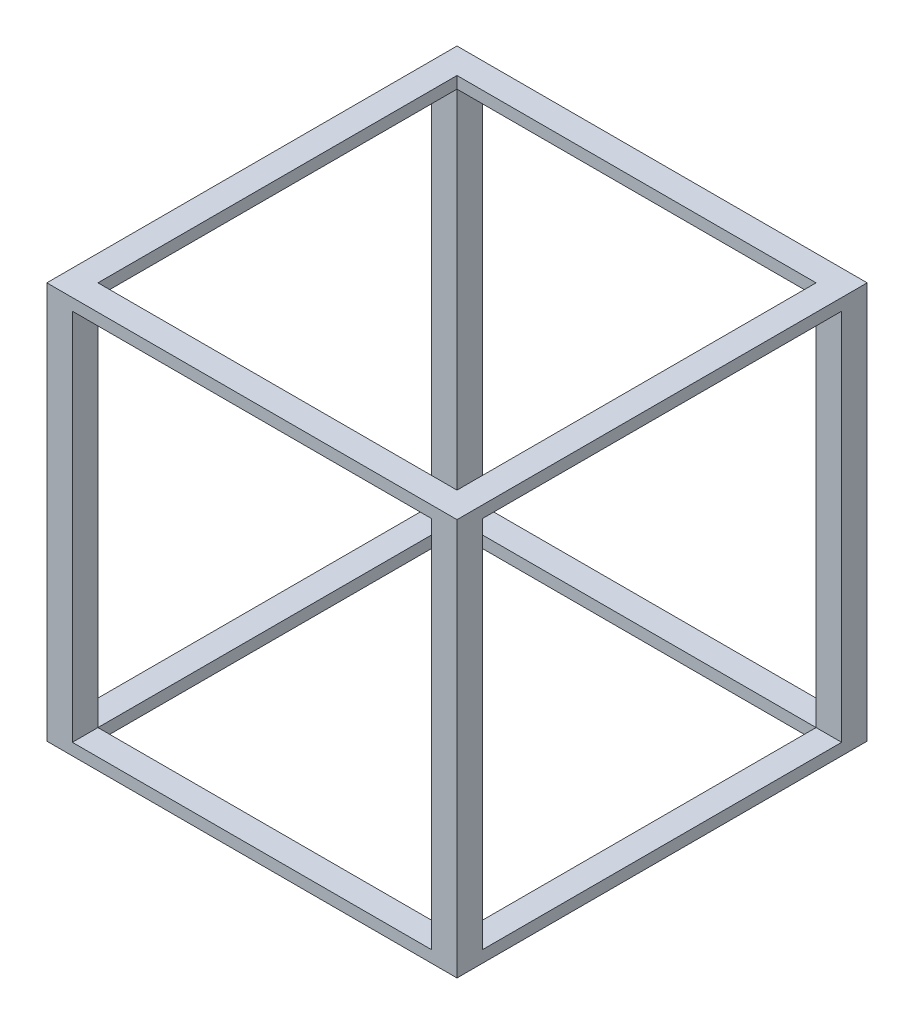
ISO-10303-21;
HEADER;
FILE_DESCRIPTION(('STEP AP214'),'2;1');
FILE_NAME('part.step','',(''),(''),'','','');
FILE_SCHEMA(('AUTOMOTIVE_DESIGN { 1 0 10303 214 1 1 1 1 }'));
ENDSEC;
DATA;
#1=APPLICATION_CONTEXT('core data for automotive mechanical design processes');
#2=APPLICATION_PROTOCOL_DEFINITION('international standard','automotive_design',2000,#1);
#3=PRODUCT_CONTEXT('',#1,'mechanical');
#4=PRODUCT('Part','Part','',(#3));
#5=PRODUCT_RELATED_PRODUCT_CATEGORY('part','',(#4));
#6=PRODUCT_DEFINITION_FORMATION('','',#4);
#7=PRODUCT_DEFINITION_CONTEXT('part definition',#1,'design');
#8=PRODUCT_DEFINITION('design','',#6,#7);
#9=PRODUCT_DEFINITION_SHAPE('','',#8);
#10=(LENGTH_UNIT() NAMED_UNIT(*) SI_UNIT(.MILLI.,.METRE.));
#11=(NAMED_UNIT(*) PLANE_ANGLE_UNIT() SI_UNIT($,.RADIAN.));
#12=(NAMED_UNIT(*) SI_UNIT($,.STERADIAN.) SOLID_ANGLE_UNIT());
#13=UNCERTAINTY_MEASURE_WITH_UNIT(LENGTH_MEASURE(1.E-05),#10,'distance_accuracy_value','');
#14=(GEOMETRIC_REPRESENTATION_CONTEXT(3) GLOBAL_UNCERTAINTY_ASSIGNED_CONTEXT((#13)) GLOBAL_UNIT_ASSIGNED_CONTEXT((#10,
#11,#12)) REPRESENTATION_CONTEXT('',''));
#15=CARTESIAN_POINT('',(0.,0.,0.));
#16=DIRECTION('',(0.,0.,1.));
#17=DIRECTION('',(1.,0.,0.));
#18=AXIS2_PLACEMENT_3D('',#15,#16,#17);
#19=CARTESIAN_POINT('',(0.,3.,0.));
#20=DIRECTION('',(0.,-1.,0.));
#21=DIRECTION('',(0.,0.,-1.));
#22=AXIS2_PLACEMENT_3D('',#19,#20,#21);
#23=PLANE('',#22);
#24=DIRECTION('',(0.,0.,1.));
#25=VECTOR('',#24,1.);
#26=CARTESIAN_POINT('',(45.6804986141416,3.,45.6804986141416));
#27=LINE('',#26,#25);
#28=CARTESIAN_POINT('',(45.6804986141416,3.,45.6804986141416));
#29=VERTEX_POINT('',#28);
#30=CARTESIAN_POINT('',(45.6804986141416,3.,52.1804986141418));
#31=VERTEX_POINT('',#30);
#32=EDGE_CURVE('E286',#29,#31,#27,.T.);
#33=ORIENTED_EDGE('',*,*,#32,.F.);
#34=DIRECTION('',(1.,0.,0.));
#35=VECTOR('',#34,1.);
#36=CARTESIAN_POINT('',(45.6804986141416,3.,45.6804986141416));
#37=LINE('',#36,#35);
#38=CARTESIAN_POINT('',(-45.6804986141418,3.,45.6804986141416));
#39=VERTEX_POINT('',#38);
#40=EDGE_CURVE('E386',#39,#29,#37,.T.);
#41=ORIENTED_EDGE('',*,*,#40,.F.);
#42=DIRECTION('',(0.,0.,-1.));
#43=VECTOR('',#42,1.);
#44=CARTESIAN_POINT('',(-45.6804986141418,3.,45.6804986141416));
#45=LINE('',#44,#43);
#46=CARTESIAN_POINT('',(-45.6804986141418,3.,52.1804986141418));
#47=VERTEX_POINT('',#46);
#48=EDGE_CURVE('E314',#47,#39,#45,.T.);
#49=ORIENTED_EDGE('',*,*,#48,.F.);
#50=DIRECTION('',(1.,0.,0.));
#51=VECTOR('',#50,1.);
#52=CARTESIAN_POINT('',(-52.1804986141418,3.,52.1804986141418));
#53=LINE('',#52,#51);
#54=EDGE_CURVE('E67',#47,#31,#53,.T.);
#55=ORIENTED_EDGE('',*,*,#54,.T.);
#56=EDGE_LOOP('',(#33,#41,#49,#55));
#57=FACE_BOUND('',#56,.T.);
#58=ADVANCED_FACE('F43',(#57),#23,.F.);
#59=DIRECTION('',(-1.,0.,0.));
#60=VECTOR('',#59,1.);
#61=CARTESIAN_POINT('',(45.6804986141416,3.,45.6804986141416));
#62=LINE('',#61,#60);
#63=CARTESIAN_POINT('',(52.1804986141418,3.,45.6804986141416));
#64=VERTEX_POINT('',#63);
#65=EDGE_CURVE('E59',#64,#29,#62,.T.);
#66=ORIENTED_EDGE('',*,*,#65,.F.);
#67=DIRECTION('',(0.,0.,-1.));
#68=VECTOR('',#67,1.);
#69=CARTESIAN_POINT('',(52.1804986141418,3.,52.1804986141418));
#70=LINE('',#69,#68);
#71=CARTESIAN_POINT('',(52.1804986141418,3.,-45.6804986141417));
#72=VERTEX_POINT('',#71);
#73=EDGE_CURVE('E428',#64,#72,#70,.T.);
#74=ORIENTED_EDGE('',*,*,#73,.T.);
#75=DIRECTION('',(1.,0.,0.));
#76=VECTOR('',#75,1.);
#77=CARTESIAN_POINT('',(52.1804986141418,3.,-45.6804986141418));
#78=LINE('',#77,#76);
#79=CARTESIAN_POINT('',(45.6804986141416,3.,-45.6804986141418));
#80=VERTEX_POINT('',#79);
#81=EDGE_CURVE('E338',#80,#72,#78,.T.);
#82=ORIENTED_EDGE('',*,*,#81,.F.);
#83=DIRECTION('',(0.,0.,-1.));
#84=VECTOR('',#83,1.);
#85=CARTESIAN_POINT('',(45.6804986141416,3.,45.6804986141416));
#86=LINE('',#85,#84);
#87=EDGE_CURVE('E391',#29,#80,#86,.T.);
#88=ORIENTED_EDGE('',*,*,#87,.F.);
#89=EDGE_LOOP('',(#66,#74,#82,#88));
#90=FACE_BOUND('',#89,.T.);
#91=ADVANCED_FACE('F554',(#90),#23,.F.);
#92=DIRECTION('',(-1.,0.,0.));
#93=VECTOR('',#92,1.);
#94=CARTESIAN_POINT('',(-45.6804986141418,3.,45.6804986141416));
#95=LINE('',#94,#93);
#96=CARTESIAN_POINT('',(-52.1804986141418,3.,45.6804986141416));
#97=VERTEX_POINT('',#96);
#98=EDGE_CURVE('E310',#39,#97,#95,.T.);
#99=ORIENTED_EDGE('',*,*,#98,.F.);
#100=DIRECTION('',(0.,0.,1.));
#101=VECTOR('',#100,1.);
#102=CARTESIAN_POINT('',(-45.6804986141418,3.,45.6804986141416));
#103=LINE('',#102,#101);
#104=CARTESIAN_POINT('',(-45.6804986141418,3.,-45.6804986141418));
#105=VERTEX_POINT('',#104);
#106=EDGE_CURVE('E382',#105,#39,#103,.T.);
#107=ORIENTED_EDGE('',*,*,#106,.F.);
#108=DIRECTION('',(1.,0.,0.));
#109=VECTOR('',#108,1.);
#110=CARTESIAN_POINT('',(-52.1804986141418,3.,-45.6804986141418));
#111=LINE('',#110,#109);
#112=CARTESIAN_POINT('',(-52.1804986141418,3.,-45.6804986141417));
#113=VERTEX_POINT('',#112);
#114=EDGE_CURVE('E347',#113,#105,#111,.T.);
#115=ORIENTED_EDGE('',*,*,#114,.F.);
#116=DIRECTION('',(0.,0.,1.));
#117=VECTOR('',#116,1.);
#118=CARTESIAN_POINT('',(-52.1804986141418,3.,52.1804986141418));
#119=LINE('',#118,#117);
#120=EDGE_CURVE('E435',#113,#97,#119,.T.);
#121=ORIENTED_EDGE('',*,*,#120,.T.);
#122=EDGE_LOOP('',(#99,#107,#115,#121));
#123=FACE_BOUND('',#122,.T.);
#124=ADVANCED_FACE('F519',(#123),#23,.F.);
#125=DIRECTION('',(0.,0.,1.));
#126=VECTOR('',#125,1.);
#127=CARTESIAN_POINT('',(45.6804986141416,3.,-52.1804986141418));
#128=LINE('',#127,#126);
#129=CARTESIAN_POINT('',(45.6804986141416,3.,-52.1804986141418));
#130=VERTEX_POINT('',#129);
#131=EDGE_CURVE('E342',#130,#80,#128,.T.);
#132=ORIENTED_EDGE('',*,*,#131,.F.);
#133=DIRECTION('',(-1.,0.,0.));
#134=VECTOR('',#133,1.);
#135=CARTESIAN_POINT('',(-52.1804986141418,3.,-52.1804986141418));
#136=LINE('',#135,#134);
#137=CARTESIAN_POINT('',(-45.6804986141418,3.,-52.1804986141418));
#138=VERTEX_POINT('',#137);
#139=EDGE_CURVE('E431',#130,#138,#136,.T.);
#140=ORIENTED_EDGE('',*,*,#139,.T.);
#141=DIRECTION('',(0.,0.,-1.));
#142=VECTOR('',#141,1.);
#143=CARTESIAN_POINT('',(-45.6804986141418,3.,-52.1804986141418));
#144=LINE('',#143,#142);
#145=EDGE_CURVE('E359',#105,#138,#144,.T.);
#146=ORIENTED_EDGE('',*,*,#145,.F.);
#147=DIRECTION('',(-1.,0.,0.));
#148=VECTOR('',#147,1.);
#149=CARTESIAN_POINT('',(45.6804986141416,3.,-45.6804986141418));
#150=LINE('',#149,#148);
#151=EDGE_CURVE('E395',#80,#105,#150,.T.);
#152=ORIENTED_EDGE('',*,*,#151,.F.);
#153=EDGE_LOOP('',(#132,#140,#146,#152));
#154=FACE_BOUND('',#153,.T.);
#155=ADVANCED_FACE('F531',(#154),#23,.F.);
#156=CARTESIAN_POINT('',(0.,0.,0.));
#157=DIRECTION('',(0.,-1.,0.));
#158=DIRECTION('',(0.,0.,-1.));
#159=AXIS2_PLACEMENT_3D('',#156,#157,#158);
#160=PLANE('',#159);
#161=DIRECTION('',(0.,0.,-1.));
#162=VECTOR('',#161,1.);
#163=CARTESIAN_POINT('',(52.1804986141418,0.,52.1804986141418));
#164=LINE('',#163,#162);
#165=CARTESIAN_POINT('',(52.1804986141418,0.,52.1804986141418));
#166=VERTEX_POINT('',#165);
#167=CARTESIAN_POINT('',(52.1804986141418,0.,-52.1804986141418));
#168=VERTEX_POINT('',#167);
#169=EDGE_CURVE('E427',#166,#168,#164,.T.);
#170=ORIENTED_EDGE('',*,*,#169,.F.);
#171=DIRECTION('',(1.,0.,0.));
#172=VECTOR('',#171,1.);
#173=CARTESIAN_POINT('',(-52.1804986141418,0.,52.1804986141418));
#174=LINE('',#173,#172);
#175=CARTESIAN_POINT('',(-52.1804986141418,0.,52.1804986141418));
#176=VERTEX_POINT('',#175);
#177=EDGE_CURVE('E432',#176,#166,#174,.T.);
#178=ORIENTED_EDGE('',*,*,#177,.F.);
#179=DIRECTION('',(0.,0.,1.));
#180=VECTOR('',#179,1.);
#181=CARTESIAN_POINT('',(-52.1804986141418,0.,52.1804986141418));
#182=LINE('',#181,#180);
#183=CARTESIAN_POINT('',(-52.1804986141418,0.,-52.1804986141418));
#184=VERTEX_POINT('',#183);
#185=EDGE_CURVE('E447',#184,#176,#182,.T.);
#186=ORIENTED_EDGE('',*,*,#185,.F.);
#187=DIRECTION('',(-1.,0.,0.));
#188=VECTOR('',#187,1.);
#189=CARTESIAN_POINT('',(-52.1804986141418,0.,-52.1804986141418));
#190=LINE('',#189,#188);
#191=EDGE_CURVE('E444',#168,#184,#190,.T.);
#192=ORIENTED_EDGE('',*,*,#191,.F.);
#193=EDGE_LOOP('',(#170,#178,#186,#192));
#194=FACE_BOUND('',#193,.T.);
#195=DIRECTION('',(-1.,0.,0.));
#196=VECTOR('',#195,1.);
#197=CARTESIAN_POINT('',(45.6804986141416,0.,-45.6804986141418));
#198=LINE('',#197,#196);
#199=CARTESIAN_POINT('',(45.6804986141416,0.,-45.6804986141418));
#200=VERTEX_POINT('',#199);
#201=CARTESIAN_POINT('',(-45.6804986141418,0.,-45.6804986141418));
#202=VERTEX_POINT('',#201);
#203=EDGE_CURVE('E387',#200,#202,#198,.T.);
#204=ORIENTED_EDGE('',*,*,#203,.T.);
#205=DIRECTION('',(0.,0.,1.));
#206=VECTOR('',#205,1.);
#207=CARTESIAN_POINT('',(-45.6804986141418,0.,45.6804986141416));
#208=LINE('',#207,#206);
#209=CARTESIAN_POINT('',(-45.6804986141418,0.,45.6804986141416));
#210=VERTEX_POINT('',#209);
#211=EDGE_CURVE('E381',#202,#210,#208,.T.);
#212=ORIENTED_EDGE('',*,*,#211,.T.);
#213=DIRECTION('',(1.,0.,0.));
#214=VECTOR('',#213,1.);
#215=CARTESIAN_POINT('',(45.6804986141416,0.,45.6804986141416));
#216=LINE('',#215,#214);
#217=CARTESIAN_POINT('',(45.6804986141416,0.,45.6804986141416));
#218=VERTEX_POINT('',#217);
#219=EDGE_CURVE('E403',#210,#218,#216,.T.);
#220=ORIENTED_EDGE('',*,*,#219,.T.);
#221=DIRECTION('',(0.,0.,-1.));
#222=VECTOR('',#221,1.);
#223=CARTESIAN_POINT('',(45.6804986141416,0.,45.6804986141416));
#224=LINE('',#223,#222);
#225=EDGE_CURVE('E407',#218,#200,#224,.T.);
#226=ORIENTED_EDGE('',*,*,#225,.T.);
#227=EDGE_LOOP('',(#204,#212,#220,#226));
#228=FACE_BOUND('',#227,.T.);
#229=ADVANCED_FACE('F469',(#194,#228),#160,.T.);
#230=CARTESIAN_POINT('',(52.1804986141418,3.,52.1804986141418));
#231=DIRECTION('',(-1.,0.,0.));
#232=DIRECTION('',(0.,0.,1.));
#233=AXIS2_PLACEMENT_3D('',#230,#231,#232);
#234=PLANE('',#233);
#235=DIRECTION('',(0.,-1.,0.));
#236=VECTOR('',#235,1.);
#237=CARTESIAN_POINT('',(52.1804986141418,3.,-52.1804986141418));
#238=LINE('',#237,#236);
#239=CARTESIAN_POINT('',(52.1804986141418,101.,-52.1804986141418));
#240=VERTEX_POINT('',#239);
#241=EDGE_CURVE('E11',#240,#168,#238,.T.);
#242=ORIENTED_EDGE('',*,*,#241,.F.);
#243=DIRECTION('',(0.,0.,-1.));
#244=VECTOR('',#243,1.);
#245=CARTESIAN_POINT('',(52.1804986141418,101.,-52.1804986141418));
#246=LINE('',#245,#244);
#247=CARTESIAN_POINT('',(52.1804986141418,101.,52.1804986141418));
#248=VERTEX_POINT('',#247);
#249=EDGE_CURVE('E250',#248,#240,#246,.T.);
#250=ORIENTED_EDGE('',*,*,#249,.F.);
#251=DIRECTION('',(0.,-1.,0.));
#252=VECTOR('',#251,1.);
#253=CARTESIAN_POINT('',(52.1804986141418,3.,52.1804986141418));
#254=LINE('',#253,#252);
#255=EDGE_CURVE('E440',#248,#166,#254,.T.);
#256=ORIENTED_EDGE('',*,*,#255,.T.);
#257=ORIENTED_EDGE('',*,*,#169,.T.);
#258=EDGE_LOOP('',(#242,#250,#256,#257));
#259=FACE_BOUND('',#258,.T.);
#260=DIRECTION('',(0.,0.,-1.));
#261=VECTOR('',#260,1.);
#262=CARTESIAN_POINT('',(52.1804986141418,98.,-52.1804986141418));
#263=LINE('',#262,#261);
#264=CARTESIAN_POINT('',(52.1804986141418,98.,45.6804986141416));
#265=VERTEX_POINT('',#264);
#266=CARTESIAN_POINT('',(52.1804986141418,98.,-45.6804986141418));
#267=VERTEX_POINT('',#266);
#268=EDGE_CURVE('E266',#265,#267,#263,.T.);
#269=ORIENTED_EDGE('',*,*,#268,.T.);
#270=DIRECTION('',(0.,-1.,0.));
#271=VECTOR('',#270,1.);
#272=CARTESIAN_POINT('',(52.1804986141418,98.,-45.6804986141418));
#273=LINE('',#272,#271);
#274=EDGE_CURVE('E333',#267,#72,#273,.T.);
#275=ORIENTED_EDGE('',*,*,#274,.T.);
#276=ORIENTED_EDGE('',*,*,#73,.F.);
#277=DIRECTION('',(0.,-1.,0.));
#278=VECTOR('',#277,1.);
#279=CARTESIAN_POINT('',(52.1804986141418,98.,45.6804986141416));
#280=LINE('',#279,#278);
#281=EDGE_CURVE('E275',#265,#64,#280,.T.);
#282=ORIENTED_EDGE('',*,*,#281,.F.);
#283=EDGE_LOOP('',(#269,#275,#276,#282));
#284=FACE_BOUND('',#283,.T.);
#285=ADVANCED_FACE('F45',(#259,#284),#234,.F.);
#286=CARTESIAN_POINT('',(-52.1804986141418,3.,-52.1804986141418));
#287=DIRECTION('',(0.,0.,1.));
#288=DIRECTION('',(1.,0.,0.));
#289=AXIS2_PLACEMENT_3D('',#286,#287,#288);
#290=PLANE('',#289);
#291=DIRECTION('',(0.,-1.,0.));
#292=VECTOR('',#291,1.);
#293=CARTESIAN_POINT('',(-52.1804986141418,3.,-52.1804986141418));
#294=LINE('',#293,#292);
#295=CARTESIAN_POINT('',(-52.1804986141418,101.,-52.1804986141418));
#296=VERTEX_POINT('',#295);
#297=EDGE_CURVE('E52',#296,#184,#294,.T.);
#298=ORIENTED_EDGE('',*,*,#297,.F.);
#299=DIRECTION('',(-1.,0.,0.));
#300=VECTOR('',#299,1.);
#301=CARTESIAN_POINT('',(-52.1804986141418,101.,-52.1804986141418));
#302=LINE('',#301,#300);
#303=EDGE_CURVE('E254',#240,#296,#302,.T.);
#304=ORIENTED_EDGE('',*,*,#303,.F.);
#305=ORIENTED_EDGE('',*,*,#241,.T.);
#306=ORIENTED_EDGE('',*,*,#191,.T.);
#307=EDGE_LOOP('',(#298,#304,#305,#306));
#308=FACE_BOUND('',#307,.T.);
#309=DIRECTION('',(-1.,0.,0.));
#310=VECTOR('',#309,1.);
#311=CARTESIAN_POINT('',(-52.1804986141418,98.,-52.1804986141418));
#312=LINE('',#311,#310);
#313=CARTESIAN_POINT('',(45.6804986141416,98.,-52.1804986141418));
#314=VERTEX_POINT('',#313);
#315=CARTESIAN_POINT('',(-45.6804986141418,98.,-52.1804986141418));
#316=VERTEX_POINT('',#315);
#317=EDGE_CURVE('E246',#314,#316,#312,.T.);
#318=ORIENTED_EDGE('',*,*,#317,.T.);
#319=DIRECTION('',(0.,-1.,0.));
#320=VECTOR('',#319,1.);
#321=CARTESIAN_POINT('',(-45.6804986141418,98.,-52.1804986141418));
#322=LINE('',#321,#320);
#323=EDGE_CURVE('E363',#316,#138,#322,.T.);
#324=ORIENTED_EDGE('',*,*,#323,.T.);
#325=ORIENTED_EDGE('',*,*,#139,.F.);
#326=DIRECTION('',(0.,-1.,0.));
#327=VECTOR('',#326,1.);
#328=CARTESIAN_POINT('',(45.6804986141416,98.,-52.1804986141418));
#329=LINE('',#328,#327);
#330=EDGE_CURVE('E319',#314,#130,#329,.T.);
#331=ORIENTED_EDGE('',*,*,#330,.F.);
#332=EDGE_LOOP('',(#318,#324,#325,#331));
#333=FACE_BOUND('',#332,.T.);
#334=ADVANCED_FACE('F478',(#308,#333),#290,.F.);
#335=CARTESIAN_POINT('',(-52.1804986141418,3.,52.1804986141418));
#336=DIRECTION('',(1.,0.,0.));
#337=DIRECTION('',(0.,0.,-1.));
#338=AXIS2_PLACEMENT_3D('',#335,#336,#337);
#339=PLANE('',#338);
#340=DIRECTION('',(0.,-1.,0.));
#341=VECTOR('',#340,1.);
#342=CARTESIAN_POINT('',(-52.1804986141418,98.,-45.6804986141418));
#343=LINE('',#342,#341);
#344=CARTESIAN_POINT('',(-52.1804986141418,98.,-45.6804986141418));
#345=VERTEX_POINT('',#344);
#346=EDGE_CURVE('E377',#345,#113,#343,.T.);
#347=ORIENTED_EDGE('',*,*,#346,.F.);
#348=DIRECTION('',(0.,0.,1.));
#349=VECTOR('',#348,1.);
#350=CARTESIAN_POINT('',(-52.1804986141418,98.,-52.1804986141418));
#351=LINE('',#350,#349);
#352=CARTESIAN_POINT('',(-52.1804986141418,98.,45.6804986141416));
#353=VERTEX_POINT('',#352);
#354=EDGE_CURVE('E206',#345,#353,#351,.T.);
#355=ORIENTED_EDGE('',*,*,#354,.T.);
#356=DIRECTION('',(0.,-1.,0.));
#357=VECTOR('',#356,1.);
#358=CARTESIAN_POINT('',(-52.1804986141418,98.,45.6804986141416));
#359=LINE('',#358,#357);
#360=EDGE_CURVE('E301',#353,#97,#359,.T.);
#361=ORIENTED_EDGE('',*,*,#360,.T.);
#362=ORIENTED_EDGE('',*,*,#120,.F.);
#363=EDGE_LOOP('',(#347,#355,#361,#362));
#364=FACE_BOUND('',#363,.T.);
#365=ORIENTED_EDGE('',*,*,#185,.T.);
#366=DIRECTION('',(0.,-1.,0.));
#367=VECTOR('',#366,1.);
#368=CARTESIAN_POINT('',(-52.1804986141418,3.,52.1804986141418));
#369=LINE('',#368,#367);
#370=CARTESIAN_POINT('',(-52.1804986141418,101.,52.1804986141418));
#371=VERTEX_POINT('',#370);
#372=EDGE_CURVE('E455',#371,#176,#369,.T.);
#373=ORIENTED_EDGE('',*,*,#372,.F.);
#374=DIRECTION('',(0.,0.,1.));
#375=VECTOR('',#374,1.);
#376=CARTESIAN_POINT('',(-52.1804986141418,101.,-52.1804986141418));
#377=LINE('',#376,#375);
#378=EDGE_CURVE('E241',#296,#371,#377,.T.);
#379=ORIENTED_EDGE('',*,*,#378,.F.);
#380=ORIENTED_EDGE('',*,*,#297,.T.);
#381=EDGE_LOOP('',(#365,#373,#379,#380));
#382=FACE_BOUND('',#381,.T.);
#383=ADVANCED_FACE('F463',(#364,#382),#339,.F.);
#384=CARTESIAN_POINT('',(-52.1804986141418,3.,52.1804986141418));
#385=DIRECTION('',(0.,0.,-1.));
#386=DIRECTION('',(-1.,0.,0.));
#387=AXIS2_PLACEMENT_3D('',#384,#385,#386);
#388=PLANE('',#387);
#389=DIRECTION('',(0.,-1.,0.));
#390=VECTOR('',#389,1.);
#391=CARTESIAN_POINT('',(-45.6804986141418,98.,52.1804986141418));
#392=LINE('',#391,#390);
#393=CARTESIAN_POINT('',(-45.6804986141418,98.,52.1804986141418));
#394=VERTEX_POINT('',#393);
#395=EDGE_CURVE('E305',#394,#47,#392,.T.);
#396=ORIENTED_EDGE('',*,*,#395,.F.);
#397=DIRECTION('',(1.,0.,0.));
#398=VECTOR('',#397,1.);
#399=CARTESIAN_POINT('',(-52.1804986141418,98.,52.1804986141418));
#400=LINE('',#399,#398);
#401=CARTESIAN_POINT('',(45.6804986141416,98.,52.1804986141418));
#402=VERTEX_POINT('',#401);
#403=EDGE_CURVE('E262',#394,#402,#400,.T.);
#404=ORIENTED_EDGE('',*,*,#403,.T.);
#405=DIRECTION('',(0.,-1.,0.));
#406=VECTOR('',#405,1.);
#407=CARTESIAN_POINT('',(45.6804986141416,98.,52.1804986141418));
#408=LINE('',#407,#406);
#409=EDGE_CURVE('E258',#402,#31,#408,.T.);
#410=ORIENTED_EDGE('',*,*,#409,.T.);
#411=ORIENTED_EDGE('',*,*,#54,.F.);
#412=EDGE_LOOP('',(#396,#404,#410,#411));
#413=FACE_BOUND('',#412,.T.);
#414=ORIENTED_EDGE('',*,*,#177,.T.);
#415=ORIENTED_EDGE('',*,*,#255,.F.);
#416=DIRECTION('',(1.,0.,0.));
#417=VECTOR('',#416,1.);
#418=CARTESIAN_POINT('',(-52.1804986141418,101.,52.1804986141418));
#419=LINE('',#418,#417);
#420=EDGE_CURVE('E245',#371,#248,#419,.T.);
#421=ORIENTED_EDGE('',*,*,#420,.F.);
#422=ORIENTED_EDGE('',*,*,#372,.T.);
#423=EDGE_LOOP('',(#414,#415,#421,#422));
#424=FACE_BOUND('',#423,.T.);
#425=ADVANCED_FACE('F472',(#413,#424),#388,.F.);
#426=CARTESIAN_POINT('',(-45.6804986141418,3.,45.6804986141416));
#427=DIRECTION('',(1.,0.,0.));
#428=DIRECTION('',(0.,0.,-1.));
#429=AXIS2_PLACEMENT_3D('',#426,#427,#428);
#430=PLANE('',#429);
#431=ORIENTED_EDGE('',*,*,#211,.F.);
#432=DIRECTION('',(0.,-1.,0.));
#433=VECTOR('',#432,1.);
#434=CARTESIAN_POINT('',(-45.6804986141418,3.,-45.6804986141418));
#435=LINE('',#434,#433);
#436=EDGE_CURVE('E399',#105,#202,#435,.T.);
#437=ORIENTED_EDGE('',*,*,#436,.F.);
#438=ORIENTED_EDGE('',*,*,#106,.T.);
#439=DIRECTION('',(0.,-1.,0.));
#440=VECTOR('',#439,1.);
#441=CARTESIAN_POINT('',(-45.6804986141418,3.,45.6804986141416));
#442=LINE('',#441,#440);
#443=EDGE_CURVE('E423',#39,#210,#442,.T.);
#444=ORIENTED_EDGE('',*,*,#443,.T.);
#445=EDGE_LOOP('',(#431,#437,#438,#444));
#446=FACE_BOUND('',#445,.T.);
#447=ADVANCED_FACE('F522',(#446),#430,.T.);
#448=CARTESIAN_POINT('',(45.6804986141416,3.,45.6804986141416));
#449=DIRECTION('',(0.,0.,-1.));
#450=DIRECTION('',(-1.,0.,0.));
#451=AXIS2_PLACEMENT_3D('',#448,#449,#450);
#452=PLANE('',#451);
#453=ORIENTED_EDGE('',*,*,#219,.F.);
#454=ORIENTED_EDGE('',*,*,#443,.F.);
#455=ORIENTED_EDGE('',*,*,#40,.T.);
#456=DIRECTION('',(0.,-1.,0.));
#457=VECTOR('',#456,1.);
#458=CARTESIAN_POINT('',(45.6804986141416,3.,45.6804986141416));
#459=LINE('',#458,#457);
#460=EDGE_CURVE('E420',#29,#218,#459,.T.);
#461=ORIENTED_EDGE('',*,*,#460,.T.);
#462=EDGE_LOOP('',(#453,#454,#455,#461));
#463=FACE_BOUND('',#462,.T.);
#464=ADVANCED_FACE('F619',(#463),#452,.T.);
#465=CARTESIAN_POINT('',(45.6804986141416,3.,45.6804986141416));
#466=DIRECTION('',(-1.,0.,0.));
#467=DIRECTION('',(0.,0.,1.));
#468=AXIS2_PLACEMENT_3D('',#465,#466,#467);
#469=PLANE('',#468);
#470=ORIENTED_EDGE('',*,*,#225,.F.);
#471=ORIENTED_EDGE('',*,*,#460,.F.);
#472=ORIENTED_EDGE('',*,*,#87,.T.);
#473=DIRECTION('',(0.,-1.,0.));
#474=VECTOR('',#473,1.);
#475=CARTESIAN_POINT('',(45.6804986141416,3.,-45.6804986141418));
#476=LINE('',#475,#474);
#477=EDGE_CURVE('E417',#80,#200,#476,.T.);
#478=ORIENTED_EDGE('',*,*,#477,.T.);
#479=EDGE_LOOP('',(#470,#471,#472,#478));
#480=FACE_BOUND('',#479,.T.);
#481=ADVANCED_FACE('F625',(#480),#469,.T.);
#482=CARTESIAN_POINT('',(45.6804986141416,3.,-45.6804986141418));
#483=DIRECTION('',(0.,0.,1.));
#484=DIRECTION('',(1.,0.,0.));
#485=AXIS2_PLACEMENT_3D('',#482,#483,#484);
#486=PLANE('',#485);
#487=ORIENTED_EDGE('',*,*,#203,.F.);
#488=ORIENTED_EDGE('',*,*,#477,.F.);
#489=ORIENTED_EDGE('',*,*,#151,.T.);
#490=ORIENTED_EDGE('',*,*,#436,.T.);
#491=EDGE_LOOP('',(#487,#488,#489,#490));
#492=FACE_BOUND('',#491,.T.);
#493=ADVANCED_FACE('F528',(#492),#486,.T.);
#494=CARTESIAN_POINT('',(-52.1804986141418,98.,-45.6804986141418));
#495=DIRECTION('',(0.,0.,-1.));
#496=DIRECTION('',(-1.,0.,0.));
#497=AXIS2_PLACEMENT_3D('',#494,#495,#496);
#498=PLANE('',#497);
#499=ORIENTED_EDGE('',*,*,#114,.T.);
#500=DIRECTION('',(0.,-1.,0.));
#501=VECTOR('',#500,1.);
#502=CARTESIAN_POINT('',(-45.6804986141418,98.,-45.6804986141418));
#503=LINE('',#502,#501);
#504=CARTESIAN_POINT('',(-45.6804986141418,98.,-45.6804986141418));
#505=VERTEX_POINT('',#504);
#506=EDGE_CURVE('E373',#505,#105,#503,.T.);
#507=ORIENTED_EDGE('',*,*,#506,.F.);
#508=DIRECTION('',(1.,0.,0.));
#509=VECTOR('',#508,1.);
#510=CARTESIAN_POINT('',(-52.1804986141418,98.,-45.6804986141418));
#511=LINE('',#510,#509);
#512=EDGE_CURVE('E354',#345,#505,#511,.T.);
#513=ORIENTED_EDGE('',*,*,#512,.F.);
#514=ORIENTED_EDGE('',*,*,#346,.T.);
#515=EDGE_LOOP('',(#499,#507,#513,#514));
#516=FACE_BOUND('',#515,.T.);
#517=ADVANCED_FACE('F517',(#516),#498,.F.);
#518=CARTESIAN_POINT('',(-45.6804986141418,98.,-52.1804986141418));
#519=DIRECTION('',(-1.,0.,0.));
#520=DIRECTION('',(0.,0.,1.));
#521=AXIS2_PLACEMENT_3D('',#518,#519,#520);
#522=PLANE('',#521);
#523=ORIENTED_EDGE('',*,*,#145,.T.);
#524=ORIENTED_EDGE('',*,*,#323,.F.);
#525=DIRECTION('',(0.,0.,-1.));
#526=VECTOR('',#525,1.);
#527=CARTESIAN_POINT('',(-45.6804986141418,98.,-52.1804986141418));
#528=LINE('',#527,#526);
#529=EDGE_CURVE('E358',#505,#316,#528,.T.);
#530=ORIENTED_EDGE('',*,*,#529,.F.);
#531=ORIENTED_EDGE('',*,*,#506,.T.);
#532=EDGE_LOOP('',(#523,#524,#530,#531));
#533=FACE_BOUND('',#532,.T.);
#534=ADVANCED_FACE('F488',(#533),#522,.F.);
#535=CARTESIAN_POINT('',(45.6804986141416,98.,-52.1804986141418));
#536=DIRECTION('',(1.,0.,0.));
#537=DIRECTION('',(0.,0.,-1.));
#538=AXIS2_PLACEMENT_3D('',#535,#536,#537);
#539=PLANE('',#538);
#540=ORIENTED_EDGE('',*,*,#131,.T.);
#541=DIRECTION('',(0.,-1.,0.));
#542=VECTOR('',#541,1.);
#543=CARTESIAN_POINT('',(45.6804986141416,98.,-45.6804986141418));
#544=LINE('',#543,#542);
#545=CARTESIAN_POINT('',(45.6804986141416,98.,-45.6804986141418));
#546=VERTEX_POINT('',#545);
#547=EDGE_CURVE('E329',#546,#80,#544,.T.);
#548=ORIENTED_EDGE('',*,*,#547,.F.);
#549=DIRECTION('',(0.,0.,1.));
#550=VECTOR('',#549,1.);
#551=CARTESIAN_POINT('',(45.6804986141416,98.,-52.1804986141418));
#552=LINE('',#551,#550);
#553=EDGE_CURVE('E343',#314,#546,#552,.T.);
#554=ORIENTED_EDGE('',*,*,#553,.F.);
#555=ORIENTED_EDGE('',*,*,#330,.T.);
#556=EDGE_LOOP('',(#540,#548,#554,#555));
#557=FACE_BOUND('',#556,.T.);
#558=ADVANCED_FACE('F533',(#557),#539,.F.);
#559=CARTESIAN_POINT('',(52.1804986141418,98.,-45.6804986141418));
#560=DIRECTION('',(0.,0.,-1.));
#561=DIRECTION('',(-1.,0.,0.));
#562=AXIS2_PLACEMENT_3D('',#559,#560,#561);
#563=PLANE('',#562);
#564=ORIENTED_EDGE('',*,*,#81,.T.);
#565=ORIENTED_EDGE('',*,*,#274,.F.);
#566=DIRECTION('',(1.,0.,0.));
#567=VECTOR('',#566,1.);
#568=CARTESIAN_POINT('',(52.1804986141418,98.,-45.6804986141418));
#569=LINE('',#568,#567);
#570=EDGE_CURVE('E337',#546,#267,#569,.T.);
#571=ORIENTED_EDGE('',*,*,#570,.F.);
#572=ORIENTED_EDGE('',*,*,#547,.T.);
#573=EDGE_LOOP('',(#564,#565,#571,#572));
#574=FACE_BOUND('',#573,.T.);
#575=ADVANCED_FACE('F536',(#574),#563,.F.);
#576=CARTESIAN_POINT('',(-45.6804986141418,98.,45.6804986141416));
#577=DIRECTION('',(-1.,0.,0.));
#578=DIRECTION('',(0.,0.,1.));
#579=AXIS2_PLACEMENT_3D('',#576,#577,#578);
#580=PLANE('',#579);
#581=ORIENTED_EDGE('',*,*,#48,.T.);
#582=DIRECTION('',(0.,-1.,0.));
#583=VECTOR('',#582,1.);
#584=CARTESIAN_POINT('',(-45.6804986141418,98.,45.6804986141416));
#585=LINE('',#584,#583);
#586=CARTESIAN_POINT('',(-45.6804986141418,98.,45.6804986141416));
#587=VERTEX_POINT('',#586);
#588=EDGE_CURVE('E291',#587,#39,#585,.T.);
#589=ORIENTED_EDGE('',*,*,#588,.F.);
#590=DIRECTION('',(0.,0.,-1.));
#591=VECTOR('',#590,1.);
#592=CARTESIAN_POINT('',(-45.6804986141418,98.,45.6804986141416));
#593=LINE('',#592,#591);
#594=EDGE_CURVE('E315',#394,#587,#593,.T.);
#595=ORIENTED_EDGE('',*,*,#594,.F.);
#596=ORIENTED_EDGE('',*,*,#395,.T.);
#597=EDGE_LOOP('',(#581,#589,#595,#596));
#598=FACE_BOUND('',#597,.T.);
#599=ADVANCED_FACE('F507',(#598),#580,.F.);
#600=CARTESIAN_POINT('',(-45.6804986141418,98.,45.6804986141416));
#601=DIRECTION('',(0.,0.,1.));
#602=DIRECTION('',(1.,0.,0.));
#603=AXIS2_PLACEMENT_3D('',#600,#601,#602);
#604=PLANE('',#603);
#605=ORIENTED_EDGE('',*,*,#98,.T.);
#606=ORIENTED_EDGE('',*,*,#360,.F.);
#607=DIRECTION('',(-1.,0.,0.));
#608=VECTOR('',#607,1.);
#609=CARTESIAN_POINT('',(-45.6804986141418,98.,45.6804986141416));
#610=LINE('',#609,#608);
#611=EDGE_CURVE('E309',#587,#353,#610,.T.);
#612=ORIENTED_EDGE('',*,*,#611,.F.);
#613=ORIENTED_EDGE('',*,*,#588,.T.);
#614=EDGE_LOOP('',(#605,#606,#612,#613));
#615=FACE_BOUND('',#614,.T.);
#616=ADVANCED_FACE('F514',(#615),#604,.F.);
#617=CARTESIAN_POINT('',(45.6804986141416,98.,45.6804986141416));
#618=DIRECTION('',(1.,0.,0.));
#619=DIRECTION('',(0.,0.,-1.));
#620=AXIS2_PLACEMENT_3D('',#617,#618,#619);
#621=PLANE('',#620);
#622=ORIENTED_EDGE('',*,*,#32,.T.);
#623=ORIENTED_EDGE('',*,*,#409,.F.);
#624=DIRECTION('',(0.,0.,1.));
#625=VECTOR('',#624,1.);
#626=CARTESIAN_POINT('',(45.6804986141416,98.,45.6804986141416));
#627=LINE('',#626,#625);
#628=CARTESIAN_POINT('',(45.6804986141416,98.,45.6804986141416));
#629=VERTEX_POINT('',#628);
#630=EDGE_CURVE('E287',#629,#402,#627,.T.);
#631=ORIENTED_EDGE('',*,*,#630,.F.);
#632=DIRECTION('',(0.,-1.,0.));
#633=VECTOR('',#632,1.);
#634=CARTESIAN_POINT('',(45.6804986141416,98.,45.6804986141416));
#635=LINE('',#634,#633);
#636=EDGE_CURVE('E279',#629,#29,#635,.T.);
#637=ORIENTED_EDGE('',*,*,#636,.T.);
#638=EDGE_LOOP('',(#622,#623,#631,#637));
#639=FACE_BOUND('',#638,.T.);
#640=ADVANCED_FACE('F543',(#639),#621,.F.);
#641=CARTESIAN_POINT('',(45.6804986141416,98.,45.6804986141416));
#642=DIRECTION('',(0.,0.,1.));
#643=DIRECTION('',(1.,0.,0.));
#644=AXIS2_PLACEMENT_3D('',#641,#642,#643);
#645=PLANE('',#644);
#646=ORIENTED_EDGE('',*,*,#65,.T.);
#647=ORIENTED_EDGE('',*,*,#636,.F.);
#648=DIRECTION('',(-1.,0.,0.));
#649=VECTOR('',#648,1.);
#650=CARTESIAN_POINT('',(45.6804986141416,98.,45.6804986141416));
#651=LINE('',#650,#649);
#652=EDGE_CURVE('E283',#265,#629,#651,.T.);
#653=ORIENTED_EDGE('',*,*,#652,.F.);
#654=ORIENTED_EDGE('',*,*,#281,.T.);
#655=EDGE_LOOP('',(#646,#647,#653,#654));
#656=FACE_BOUND('',#655,.T.);
#657=ADVANCED_FACE('F541',(#656),#645,.F.);
#658=CARTESIAN_POINT('',(0.,98.,0.));
#659=DIRECTION('',(0.,1.,0.));
#660=DIRECTION('',(0.,0.,1.));
#661=AXIS2_PLACEMENT_3D('',#658,#659,#660);
#662=PLANE('',#661);
#663=ORIENTED_EDGE('',*,*,#354,.F.);
#664=ORIENTED_EDGE('',*,*,#512,.T.);
#665=DIRECTION('',(0.,0.,1.));
#666=VECTOR('',#665,1.);
#667=CARTESIAN_POINT('',(-45.6804986141418,98.,-45.6804986141418));
#668=LINE('',#667,#666);
#669=EDGE_CURVE('E221',#505,#587,#668,.T.);
#670=ORIENTED_EDGE('',*,*,#669,.T.);
#671=ORIENTED_EDGE('',*,*,#611,.T.);
#672=EDGE_LOOP('',(#663,#664,#670,#671));
#673=FACE_BOUND('',#672,.T.);
#674=ADVANCED_FACE('F491',(#673),#662,.F.);
#675=DIRECTION('',(-1.,0.,0.));
#676=VECTOR('',#675,1.);
#677=CARTESIAN_POINT('',(-45.6804986141418,98.,-45.6804986141418));
#678=LINE('',#677,#676);
#679=EDGE_CURVE('E196',#546,#505,#678,.T.);
#680=ORIENTED_EDGE('',*,*,#679,.T.);
#681=ORIENTED_EDGE('',*,*,#529,.T.);
#682=ORIENTED_EDGE('',*,*,#317,.F.);
#683=ORIENTED_EDGE('',*,*,#553,.T.);
#684=EDGE_LOOP('',(#680,#681,#682,#683));
#685=FACE_BOUND('',#684,.T.);
#686=ADVANCED_FACE('F484',(#685),#662,.F.);
#687=DIRECTION('',(0.,0.,-1.));
#688=VECTOR('',#687,1.);
#689=CARTESIAN_POINT('',(45.6804986141416,98.,-45.6804986141418));
#690=LINE('',#689,#688);
#691=EDGE_CURVE('E226',#629,#546,#690,.T.);
#692=ORIENTED_EDGE('',*,*,#691,.T.);
#693=ORIENTED_EDGE('',*,*,#570,.T.);
#694=ORIENTED_EDGE('',*,*,#268,.F.);
#695=ORIENTED_EDGE('',*,*,#652,.T.);
#696=EDGE_LOOP('',(#692,#693,#694,#695));
#697=FACE_BOUND('',#696,.T.);
#698=ADVANCED_FACE('F538',(#697),#662,.F.);
#699=ORIENTED_EDGE('',*,*,#403,.F.);
#700=ORIENTED_EDGE('',*,*,#594,.T.);
#701=DIRECTION('',(1.,0.,0.));
#702=VECTOR('',#701,1.);
#703=CARTESIAN_POINT('',(-45.6804986141418,98.,45.6804986141416));
#704=LINE('',#703,#702);
#705=EDGE_CURVE('E204',#587,#629,#704,.T.);
#706=ORIENTED_EDGE('',*,*,#705,.T.);
#707=ORIENTED_EDGE('',*,*,#630,.T.);
#708=EDGE_LOOP('',(#699,#700,#706,#707));
#709=FACE_BOUND('',#708,.T.);
#710=ADVANCED_FACE('F502',(#709),#662,.F.);
#711=CARTESIAN_POINT('',(0.,101.,0.));
#712=DIRECTION('',(0.,1.,0.));
#713=DIRECTION('',(0.,0.,1.));
#714=AXIS2_PLACEMENT_3D('',#711,#712,#713);
#715=PLANE('',#714);
#716=ORIENTED_EDGE('',*,*,#378,.T.);
#717=ORIENTED_EDGE('',*,*,#420,.T.);
#718=ORIENTED_EDGE('',*,*,#249,.T.);
#719=ORIENTED_EDGE('',*,*,#303,.T.);
#720=EDGE_LOOP('',(#716,#717,#718,#719));
#721=FACE_BOUND('',#720,.T.);
#722=DIRECTION('',(1.,0.,0.));
#723=VECTOR('',#722,1.);
#724=CARTESIAN_POINT('',(-45.6804986141418,101.,45.6804986141416));
#725=LINE('',#724,#723);
#726=CARTESIAN_POINT('',(-45.6804986141418,101.,45.6804986141416));
#727=VERTEX_POINT('',#726);
#728=CARTESIAN_POINT('',(45.6804986141416,101.,45.6804986141416));
#729=VERTEX_POINT('',#728);
#730=EDGE_CURVE('E195',#727,#729,#725,.T.);
#731=ORIENTED_EDGE('',*,*,#730,.F.);
#732=DIRECTION('',(0.,0.,1.));
#733=VECTOR('',#732,1.);
#734=CARTESIAN_POINT('',(-45.6804986141418,101.,-45.6804986141418));
#735=LINE('',#734,#733);
#736=CARTESIAN_POINT('',(-45.6804986141418,101.,-45.6804986141418));
#737=VERTEX_POINT('',#736);
#738=EDGE_CURVE('E183',#737,#727,#735,.T.);
#739=ORIENTED_EDGE('',*,*,#738,.F.);
#740=DIRECTION('',(-1.,0.,0.));
#741=VECTOR('',#740,1.);
#742=CARTESIAN_POINT('',(-45.6804986141418,101.,-45.6804986141418));
#743=LINE('',#742,#741);
#744=CARTESIAN_POINT('',(45.6804986141416,101.,-45.6804986141418));
#745=VERTEX_POINT('',#744);
#746=EDGE_CURVE('E216',#745,#737,#743,.T.);
#747=ORIENTED_EDGE('',*,*,#746,.F.);
#748=DIRECTION('',(0.,0.,-1.));
#749=VECTOR('',#748,1.);
#750=CARTESIAN_POINT('',(45.6804986141416,101.,-45.6804986141418));
#751=LINE('',#750,#749);
#752=EDGE_CURVE('E212',#729,#745,#751,.T.);
#753=ORIENTED_EDGE('',*,*,#752,.F.);
#754=EDGE_LOOP('',(#731,#739,#747,#753));
#755=FACE_BOUND('',#754,.T.);
#756=ADVANCED_FACE('F210',(#721,#755),#715,.T.);
#757=CARTESIAN_POINT('',(-45.6804986141418,101.,-45.6804986141418));
#758=DIRECTION('',(1.,0.,0.));
#759=DIRECTION('',(0.,0.,-1.));
#760=AXIS2_PLACEMENT_3D('',#757,#758,#759);
#761=PLANE('',#760);
#762=ORIENTED_EDGE('',*,*,#669,.F.);
#763=DIRECTION('',(0.,-1.,0.));
#764=VECTOR('',#763,1.);
#765=CARTESIAN_POINT('',(-45.6804986141418,101.,-45.6804986141418));
#766=LINE('',#765,#764);
#767=EDGE_CURVE('E190',#737,#505,#766,.T.);
#768=ORIENTED_EDGE('',*,*,#767,.F.);
#769=ORIENTED_EDGE('',*,*,#738,.T.);
#770=DIRECTION('',(0.,-1.,0.));
#771=VECTOR('',#770,1.);
#772=CARTESIAN_POINT('',(-45.6804986141418,101.,45.6804986141416));
#773=LINE('',#772,#771);
#774=EDGE_CURVE('E187',#727,#587,#773,.T.);
#775=ORIENTED_EDGE('',*,*,#774,.T.);
#776=EDGE_LOOP('',(#762,#768,#769,#775));
#777=FACE_BOUND('',#776,.T.);
#778=ADVANCED_FACE('F186',(#777),#761,.T.);
#779=CARTESIAN_POINT('',(-45.6804986141418,101.,45.6804986141416));
#780=DIRECTION('',(0.,0.,-1.));
#781=DIRECTION('',(-1.,0.,0.));
#782=AXIS2_PLACEMENT_3D('',#779,#780,#781);
#783=PLANE('',#782);
#784=ORIENTED_EDGE('',*,*,#705,.F.);
#785=ORIENTED_EDGE('',*,*,#774,.F.);
#786=ORIENTED_EDGE('',*,*,#730,.T.);
#787=DIRECTION('',(0.,-1.,0.));
#788=VECTOR('',#787,1.);
#789=CARTESIAN_POINT('',(45.6804986141416,101.,45.6804986141416));
#790=LINE('',#789,#788);
#791=EDGE_CURVE('E207',#729,#629,#790,.T.);
#792=ORIENTED_EDGE('',*,*,#791,.T.);
#793=EDGE_LOOP('',(#784,#785,#786,#792));
#794=FACE_BOUND('',#793,.T.);
#795=ADVANCED_FACE('F200',(#794),#783,.T.);
#796=CARTESIAN_POINT('',(45.6804986141416,101.,-45.6804986141418));
#797=DIRECTION('',(-1.,0.,0.));
#798=DIRECTION('',(0.,0.,1.));
#799=AXIS2_PLACEMENT_3D('',#796,#797,#798);
#800=PLANE('',#799);
#801=ORIENTED_EDGE('',*,*,#691,.F.);
#802=ORIENTED_EDGE('',*,*,#791,.F.);
#803=ORIENTED_EDGE('',*,*,#752,.T.);
#804=DIRECTION('',(0.,-1.,0.));
#805=VECTOR('',#804,1.);
#806=CARTESIAN_POINT('',(45.6804986141416,101.,-45.6804986141418));
#807=LINE('',#806,#805);
#808=EDGE_CURVE('E235',#745,#546,#807,.T.);
#809=ORIENTED_EDGE('',*,*,#808,.T.);
#810=EDGE_LOOP('',(#801,#802,#803,#809));
#811=FACE_BOUND('',#810,.T.);
#812=ADVANCED_FACE('F498',(#811),#800,.T.);
#813=CARTESIAN_POINT('',(-45.6804986141418,101.,-45.6804986141418));
#814=DIRECTION('',(0.,0.,1.));
#815=DIRECTION('',(1.,0.,0.));
#816=AXIS2_PLACEMENT_3D('',#813,#814,#815);
#817=PLANE('',#816);
#818=ORIENTED_EDGE('',*,*,#679,.F.);
#819=ORIENTED_EDGE('',*,*,#808,.F.);
#820=ORIENTED_EDGE('',*,*,#746,.T.);
#821=ORIENTED_EDGE('',*,*,#767,.T.);
#822=EDGE_LOOP('',(#818,#819,#820,#821));
#823=FACE_BOUND('',#822,.T.);
#824=ADVANCED_FACE('F495',(#823),#817,.T.);
#825=CLOSED_SHELL('',(#58,#91,#124,#155,#229,#285,#334,#383,#425,#447,#464,#481,#493,#517,#534,
#558,#575,#599,#616,#640,#657,#674,#686,#698,#710,#756,#778,#795,#812,#824));
#826=MANIFOLD_SOLID_BREP('B2',#825);
#827=ADVANCED_BREP_SHAPE_REPRESENTATION('',(#18,#826),#14);
#828=SHAPE_DEFINITION_REPRESENTATION(#9,#827);
ENDSEC;
END-ISO-10303-21;
